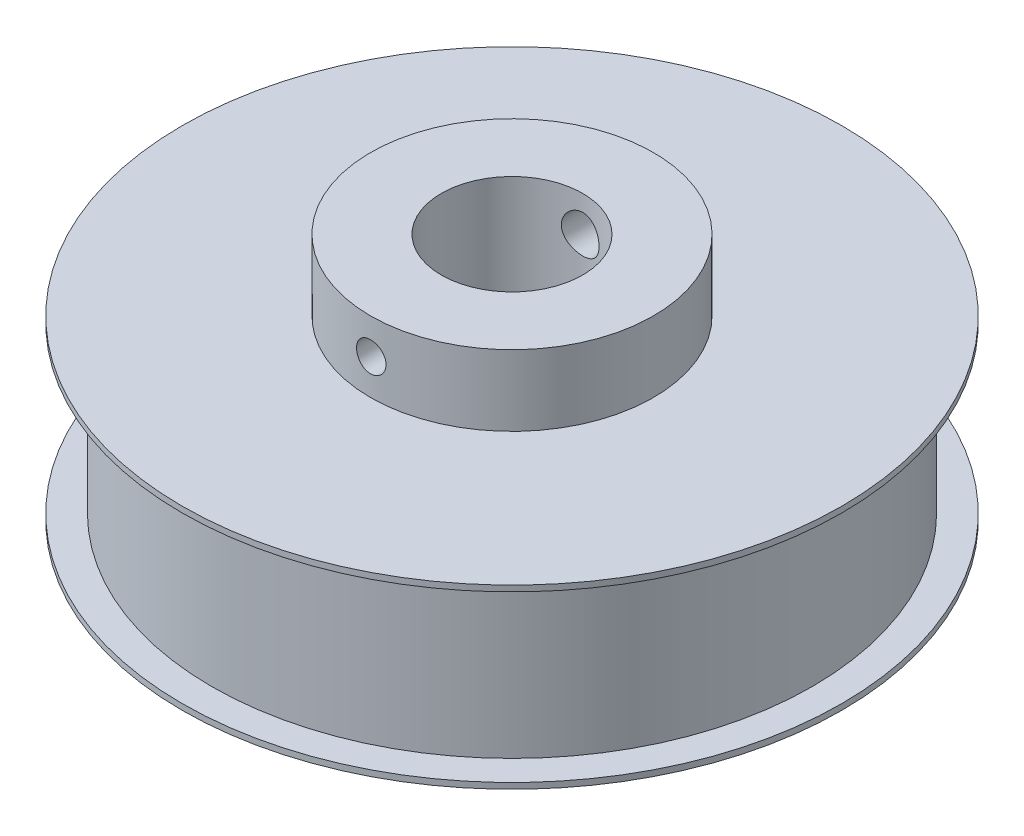
ISO-10303-21;
HEADER;
FILE_DESCRIPTION(('STEP AP214'),'2;1');
FILE_NAME('part.step','',(''),(''),'','','');
FILE_SCHEMA(('AUTOMOTIVE_DESIGN { 1 0 10303 214 1 1 1 1 }'));
ENDSEC;
DATA;
#1=APPLICATION_CONTEXT('core data for automotive mechanical design processes');
#2=APPLICATION_PROTOCOL_DEFINITION('international standard','automotive_design',2000,#1);
#3=PRODUCT_CONTEXT('',#1,'mechanical');
#4=PRODUCT('Part','Part','',(#3));
#5=PRODUCT_RELATED_PRODUCT_CATEGORY('part','',(#4));
#6=PRODUCT_DEFINITION_FORMATION('','',#4);
#7=PRODUCT_DEFINITION_CONTEXT('part definition',#1,'design');
#8=PRODUCT_DEFINITION('design','',#6,#7);
#9=PRODUCT_DEFINITION_SHAPE('','',#8);
#10=(LENGTH_UNIT() NAMED_UNIT(*) SI_UNIT(.MILLI.,.METRE.));
#11=(NAMED_UNIT(*) PLANE_ANGLE_UNIT() SI_UNIT($,.RADIAN.));
#12=(NAMED_UNIT(*) SI_UNIT($,.STERADIAN.) SOLID_ANGLE_UNIT());
#13=UNCERTAINTY_MEASURE_WITH_UNIT(LENGTH_MEASURE(1.E-05),#10,'distance_accuracy_value','');
#14=(GEOMETRIC_REPRESENTATION_CONTEXT(3) GLOBAL_UNCERTAINTY_ASSIGNED_CONTEXT((#13)) GLOBAL_UNIT_ASSIGNED_CONTEXT((#10,
#11,#12)) REPRESENTATION_CONTEXT('',''));
#15=CARTESIAN_POINT('',(0.,0.,0.));
#16=DIRECTION('',(0.,0.,1.));
#17=DIRECTION('',(1.,0.,0.));
#18=AXIS2_PLACEMENT_3D('',#15,#16,#17);
#19=CARTESIAN_POINT('',(0.,13.5,0.));
#20=DIRECTION('',(0.,1.,0.));
#21=DIRECTION('',(0.,0.,1.));
#22=AXIS2_PLACEMENT_3D('',#19,#20,#21);
#23=PLANE('',#22);
#24=CARTESIAN_POINT('',(0.,13.5,0.));
#25=DIRECTION('',(0.,1.,0.));
#26=DIRECTION('',(0.,0.,1.));
#27=AXIS2_PLACEMENT_3D('',#24,#25,#26);
#28=CIRCLE('',#27,6.);
#29=CARTESIAN_POINT('',(0.,13.5,6.));
#30=VERTEX_POINT('',#29);
#31=EDGE_CURVE('E69',#30,#30,#28,.T.);
#32=ORIENTED_EDGE('',*,*,#31,.F.);
#33=EDGE_LOOP('',(#32));
#34=FACE_BOUND('',#33,.T.);
#35=CARTESIAN_POINT('',(0.,13.5,0.));
#36=DIRECTION('',(0.,1.,0.));
#37=DIRECTION('',(0.,0.,1.));
#38=AXIS2_PLACEMENT_3D('',#35,#36,#37);
#39=CIRCLE('',#38,12.);
#40=CARTESIAN_POINT('',(0.,13.5,12.));
#41=VERTEX_POINT('',#40);
#42=EDGE_CURVE('E75',#41,#41,#39,.T.);
#43=ORIENTED_EDGE('',*,*,#42,.T.);
#44=EDGE_LOOP('',(#43));
#45=FACE_BOUND('',#44,.T.);
#46=ADVANCED_FACE('F43',(#34,#45),#23,.T.);
#47=CARTESIAN_POINT('',(0.,7.5,0.));
#48=DIRECTION('',(0.,-1.,0.));
#49=DIRECTION('',(0.,0.,-1.));
#50=AXIS2_PLACEMENT_3D('',#47,#48,#49);
#51=CYLINDRICAL_SURFACE('',#50,25.465);
#52=CARTESIAN_POINT('',(0.,-7.,0.));
#53=DIRECTION('',(0.,1.,0.));
#54=DIRECTION('',(0.,0.,1.));
#55=AXIS2_PLACEMENT_3D('',#52,#53,#54);
#56=CIRCLE('',#55,25.465);
#57=CARTESIAN_POINT('',(0.,-7.,25.465));
#58=VERTEX_POINT('',#57);
#59=EDGE_CURVE('E47',#58,#58,#56,.T.);
#60=ORIENTED_EDGE('',*,*,#59,.T.);
#61=EDGE_LOOP('',(#60));
#62=FACE_BOUND('',#61,.T.);
#63=CARTESIAN_POINT('',(0.,7.,0.));
#64=DIRECTION('',(0.,1.,0.));
#65=DIRECTION('',(0.,0.,1.));
#66=AXIS2_PLACEMENT_3D('',#63,#64,#65);
#67=CIRCLE('',#66,25.465);
#68=CARTESIAN_POINT('',(0.,7.,25.465));
#69=VERTEX_POINT('',#68);
#70=EDGE_CURVE('E10',#69,#69,#67,.T.);
#71=ORIENTED_EDGE('',*,*,#70,.F.);
#72=EDGE_LOOP('',(#71));
#73=FACE_BOUND('',#72,.T.);
#74=ADVANCED_FACE('F45',(#62,#73),#51,.T.);
#75=CARTESIAN_POINT('',(0.,7.,0.));
#76=DIRECTION('',(0.,1.,0.));
#77=DIRECTION('',(0.,0.,1.));
#78=AXIS2_PLACEMENT_3D('',#75,#76,#77);
#79=CYLINDRICAL_SURFACE('',#78,27.965);
#80=CARTESIAN_POINT('',(0.,7.,0.));
#81=DIRECTION('',(0.,1.,0.));
#82=DIRECTION('',(0.,0.,1.));
#83=AXIS2_PLACEMENT_3D('',#80,#81,#82);
#84=CIRCLE('',#83,27.965);
#85=CARTESIAN_POINT('',(0.,7.,27.965));
#86=VERTEX_POINT('',#85);
#87=EDGE_CURVE('E51',#86,#86,#84,.T.);
#88=ORIENTED_EDGE('',*,*,#87,.T.);
#89=EDGE_LOOP('',(#88));
#90=FACE_BOUND('',#89,.T.);
#91=CARTESIAN_POINT('',(0.,7.5,0.));
#92=DIRECTION('',(0.,1.,0.));
#93=DIRECTION('',(0.,0.,1.));
#94=AXIS2_PLACEMENT_3D('',#91,#92,#93);
#95=CIRCLE('',#94,27.965);
#96=CARTESIAN_POINT('',(0.,7.5,27.965));
#97=VERTEX_POINT('',#96);
#98=EDGE_CURVE('E55',#97,#97,#95,.T.);
#99=ORIENTED_EDGE('',*,*,#98,.F.);
#100=EDGE_LOOP('',(#99));
#101=FACE_BOUND('',#100,.T.);
#102=ADVANCED_FACE('F138',(#90,#101),#79,.T.);
#103=CARTESIAN_POINT('',(0.,7.,0.));
#104=DIRECTION('',(0.,1.,0.));
#105=DIRECTION('',(0.,0.,1.));
#106=AXIS2_PLACEMENT_3D('',#103,#104,#105);
#107=PLANE('',#106);
#108=ORIENTED_EDGE('',*,*,#70,.T.);
#109=EDGE_LOOP('',(#108));
#110=FACE_BOUND('',#109,.T.);
#111=ORIENTED_EDGE('',*,*,#87,.F.);
#112=EDGE_LOOP('',(#111));
#113=FACE_BOUND('',#112,.T.);
#114=ADVANCED_FACE('F135',(#110,#113),#107,.F.);
#115=CARTESIAN_POINT('',(0.,7.5,0.));
#116=DIRECTION('',(0.,1.,0.));
#117=DIRECTION('',(0.,0.,1.));
#118=AXIS2_PLACEMENT_3D('',#115,#116,#117);
#119=PLANE('',#118);
#120=ORIENTED_EDGE('',*,*,#98,.T.);
#121=EDGE_LOOP('',(#120));
#122=FACE_BOUND('',#121,.T.);
#123=CARTESIAN_POINT('',(0.,7.5,0.));
#124=DIRECTION('',(0.,1.,0.));
#125=DIRECTION('',(0.,0.,1.));
#126=AXIS2_PLACEMENT_3D('',#123,#124,#125);
#127=CIRCLE('',#126,12.);
#128=CARTESIAN_POINT('',(0.,7.5,12.));
#129=VERTEX_POINT('',#128);
#130=EDGE_CURVE('E72',#129,#129,#127,.F.);
#131=ORIENTED_EDGE('',*,*,#130,.T.);
#132=EDGE_LOOP('',(#131));
#133=FACE_BOUND('',#132,.T.);
#134=ADVANCED_FACE('F133',(#122,#133),#119,.T.);
#135=CARTESIAN_POINT('',(0.,-7.,0.));
#136=DIRECTION('',(0.,-1.,0.));
#137=DIRECTION('',(0.,0.,-1.));
#138=AXIS2_PLACEMENT_3D('',#135,#136,#137);
#139=CYLINDRICAL_SURFACE('',#138,27.965);
#140=CARTESIAN_POINT('',(0.,-7.,0.));
#141=DIRECTION('',(0.,1.,0.));
#142=DIRECTION('',(0.,0.,1.));
#143=AXIS2_PLACEMENT_3D('',#140,#141,#142);
#144=CIRCLE('',#143,27.965);
#145=CARTESIAN_POINT('',(0.,-7.,27.965));
#146=VERTEX_POINT('',#145);
#147=EDGE_CURVE('E63',#146,#146,#144,.T.);
#148=ORIENTED_EDGE('',*,*,#147,.F.);
#149=EDGE_LOOP('',(#148));
#150=FACE_BOUND('',#149,.T.);
#151=CARTESIAN_POINT('',(0.,-7.5,0.));
#152=DIRECTION('',(0.,1.,0.));
#153=DIRECTION('',(0.,0.,1.));
#154=AXIS2_PLACEMENT_3D('',#151,#152,#153);
#155=CIRCLE('',#154,27.965);
#156=CARTESIAN_POINT('',(0.,-7.5,27.965));
#157=VERTEX_POINT('',#156);
#158=EDGE_CURVE('E60',#157,#157,#155,.T.);
#159=ORIENTED_EDGE('',*,*,#158,.T.);
#160=EDGE_LOOP('',(#159));
#161=FACE_BOUND('',#160,.T.);
#162=ADVANCED_FACE('F129',(#150,#161),#139,.T.);
#163=CARTESIAN_POINT('',(0.,-7.,0.));
#164=DIRECTION('',(0.,1.,0.));
#165=DIRECTION('',(0.,0.,1.));
#166=AXIS2_PLACEMENT_3D('',#163,#164,#165);
#167=PLANE('',#166);
#168=ORIENTED_EDGE('',*,*,#59,.F.);
#169=EDGE_LOOP('',(#168));
#170=FACE_BOUND('',#169,.T.);
#171=ORIENTED_EDGE('',*,*,#147,.T.);
#172=EDGE_LOOP('',(#171));
#173=FACE_BOUND('',#172,.T.);
#174=ADVANCED_FACE('F126',(#170,#173),#167,.T.);
#175=CARTESIAN_POINT('',(0.,-7.5,0.));
#176=DIRECTION('',(0.,1.,0.));
#177=DIRECTION('',(0.,0.,1.));
#178=AXIS2_PLACEMENT_3D('',#175,#176,#177);
#179=PLANE('',#178);
#180=CARTESIAN_POINT('',(0.,-7.5,0.));
#181=DIRECTION('',(0.,1.,0.));
#182=DIRECTION('',(0.,0.,1.));
#183=AXIS2_PLACEMENT_3D('',#180,#181,#182);
#184=CIRCLE('',#183,6.);
#185=CARTESIAN_POINT('',(0.,-7.5,6.));
#186=VERTEX_POINT('',#185);
#187=EDGE_CURVE('E64',#186,#186,#184,.T.);
#188=ORIENTED_EDGE('',*,*,#187,.T.);
#189=EDGE_LOOP('',(#188));
#190=FACE_BOUND('',#189,.T.);
#191=ORIENTED_EDGE('',*,*,#158,.F.);
#192=EDGE_LOOP('',(#191));
#193=FACE_BOUND('',#192,.T.);
#194=ADVANCED_FACE('F121',(#190,#193),#179,.F.);
#195=CARTESIAN_POINT('',(0.,-7.5,0.));
#196=DIRECTION('',(0.,1.,0.));
#197=DIRECTION('',(0.,0.,1.));
#198=AXIS2_PLACEMENT_3D('',#195,#196,#197);
#199=CYLINDRICAL_SURFACE('',#198,6.);
#200=CARTESIAN_POINT('',(1.6,10.5,-5.78273291792039));
#201=CARTESIAN_POINT('',(1.59999787452612,10.411859249809,-5.7827344455633));
#202=CARTESIAN_POINT('',(1.59269194579771,10.3236959996195,-5.78477011639344));
#203=CARTESIAN_POINT('',(1.56371666608212,10.1499156627546,-5.79266848924472));
#204=CARTESIAN_POINT('',(1.54204010896768,10.0642998760175,-5.79853311126453));
#205=CARTESIAN_POINT('',(1.48508676448053,9.89815354404267,-5.81337900141366));
#206=CARTESIAN_POINT('',(1.4498291003374,9.81761603293728,-5.82235588547335));
#207=CARTESIAN_POINT('',(1.36677427650964,9.66358660795212,-5.8424092393635));
#208=CARTESIAN_POINT('',(1.3189761427316,9.5900952419944,-5.85348587227547));
#209=CARTESIAN_POINT('',(1.21091878299647,9.45040596240983,-5.87680111642766));
#210=CARTESIAN_POINT('',(1.15040238003366,9.38441038602843,-5.88906032893152));
#211=CARTESIAN_POINT('',(1.01917941827217,9.26337473843904,-5.91318161149208));
#212=CARTESIAN_POINT('',(0.948471804277313,9.20833580308657,-5.92504364026752));
#213=CARTESIAN_POINT('',(0.797470536698613,9.10993204927766,-5.94726390774734));
#214=CARTESIAN_POINT('',(0.717041455903581,9.06676838509372,-5.95759501009834));
#215=CARTESIAN_POINT('',(0.54974643578327,8.9946522917062,-5.97535300969467));
#216=CARTESIAN_POINT('',(0.46288158470008,8.96569746617476,-5.9827803966101));
#217=CARTESIAN_POINT('',(0.28729276944807,8.92347582381139,-5.99374842861169));
#218=CARTESIAN_POINT('',(0.198656979360731,8.90986481869927,-5.99737421400212));
#219=CARTESIAN_POINT('',(0.0202908428068591,8.89763430391426,-6.000628196942));
#220=CARTESIAN_POINT('',(-0.0694393179508251,8.89901228509589,-6.00025706357286));
#221=CARTESIAN_POINT('',(-0.245051389689078,8.91647825003158,-5.99562140687813));
#222=CARTESIAN_POINT('',(-0.330973280576889,8.93219436610904,-5.99145531221602));
#223=CARTESIAN_POINT('',(-0.498913052456844,8.97728971022556,-5.97981398872374));
#224=CARTESIAN_POINT('',(-0.580930710544465,9.00666971734884,-5.97233857120463));
#225=CARTESIAN_POINT('',(-0.739683156118043,9.07854387807391,-5.95477255279923));
#226=CARTESIAN_POINT('',(-0.816357349063632,9.12116544568057,-5.94465670302171));
#227=CARTESIAN_POINT('',(-0.961591999011612,9.21821505560728,-5.9228997480757));
#228=CARTESIAN_POINT('',(-1.03015087046869,9.27264539922254,-5.91125834578275));
#229=CARTESIAN_POINT('',(-1.15942829557249,9.39374148634714,-5.88729018351104));
#230=CARTESIAN_POINT('',(-1.21984153614219,9.46073155603952,-5.87495335495478));
#231=CARTESIAN_POINT('',(-1.32865065683815,9.60401974099103,-5.85130724018329));
#232=CARTESIAN_POINT('',(-1.37704580423844,9.68031842336025,-5.83999801664631));
#233=CARTESIAN_POINT('',(-1.46067743349021,9.84072008145716,-5.81964721826454));
#234=CARTESIAN_POINT('',(-1.49583093280429,9.92486828073094,-5.81062005680583));
#235=CARTESIAN_POINT('',(-1.55139201348531,10.0981811995636,-5.79603460063156));
#236=CARTESIAN_POINT('',(-1.57180325169042,10.1873446691587,-5.79047544571885));
#237=CARTESIAN_POINT('',(-1.59677405674218,10.3653017688173,-5.78363868515234));
#238=CARTESIAN_POINT('',(-1.60178906096974,10.4540268388886,-5.78223810662157));
#239=CARTESIAN_POINT('',(-1.597079848984,10.631047818242,-5.78354062803713));
#240=CARTESIAN_POINT('',(-1.58735720137773,10.7193437721938,-5.78624329125356));
#241=CARTESIAN_POINT('',(-1.55385017495931,10.8912452752781,-5.79532899431386));
#242=CARTESIAN_POINT('',(-1.53033958330325,10.9749083503511,-5.80164031753083));
#243=CARTESIAN_POINT('',(-1.47023189380391,11.1371037050867,-5.81716215168585));
#244=CARTESIAN_POINT('',(-1.43363308701324,11.2156353131416,-5.82637304120572));
#245=CARTESIAN_POINT('',(-1.34746324406962,11.3672439659485,-5.84690857976629));
#246=CARTESIAN_POINT('',(-1.29762476190338,11.4401631807119,-5.8582752389782));
#247=CARTESIAN_POINT('',(-1.18672182390012,11.5767706413624,-5.88174273547405));
#248=CARTESIAN_POINT('',(-1.12565525778373,11.6404571479633,-5.89384371048319));
#249=CARTESIAN_POINT('',(-0.991923026003868,11.7586819786,-5.91783971907433));
#250=CARTESIAN_POINT('',(-0.918973132807074,11.8129027015829,-5.92971869219044));
#251=CARTESIAN_POINT('',(-0.764742748752592,11.9083287899284,-5.95157336013737));
#252=CARTESIAN_POINT('',(-0.683462701615105,11.9495348480631,-5.96154915626333));
#253=CARTESIAN_POINT('',(-0.515451307860694,12.0173837058892,-5.978409207194));
#254=CARTESIAN_POINT('',(-0.428766282305865,12.0441352155548,-5.98531646784308));
#255=CARTESIAN_POINT('',(-0.251919507785054,12.0826309824515,-5.99536243029798));
#256=CARTESIAN_POINT('',(-0.161758533856197,12.0943785654198,-5.99850196723977));
#257=CARTESIAN_POINT('',(0.016513601076927,12.1023246589931,-6.0006193075016));
#258=CARTESIAN_POINT('',(0.104602809222312,12.0989890553049,-5.99972181030494));
#259=CARTESIAN_POINT('',(0.278918643704558,12.0779452051399,-5.9941479278306));
#260=CARTESIAN_POINT('',(0.365145339850185,12.0602374983065,-5.98947168443723));
#261=CARTESIAN_POINT('',(0.532728098771437,12.011215516065,-5.97689048312844));
#262=CARTESIAN_POINT('',(0.614113609481484,11.9799957652217,-5.96900797751776));
#263=CARTESIAN_POINT('',(0.770537678776834,11.9049203186034,-5.95083853212803));
#264=CARTESIAN_POINT('',(0.845575345328786,11.8610628507112,-5.9405512551794));
#265=CARTESIAN_POINT('',(0.989342614939897,11.7605933822889,-5.91833064980799));
#266=CARTESIAN_POINT('',(1.05785068939028,11.7036724954356,-5.90636074702983));
#267=CARTESIAN_POINT('',(1.18450029724544,11.5792778005135,-5.88227200056129));
#268=CARTESIAN_POINT('',(1.24263909793084,11.5118012193649,-5.87015311850574));
#269=CARTESIAN_POINT('',(1.34816560187261,11.3664252833275,-5.84683167732792));
#270=CARTESIAN_POINT('',(1.39528875413901,11.2883293490008,-5.83565513061492));
#271=CARTESIAN_POINT('',(1.47566951228968,11.1250349512375,-5.81585115203583));
#272=CARTESIAN_POINT('',(1.50893618695116,11.0398411771482,-5.80722205399804));
#273=CARTESIAN_POINT('',(1.5563049940103,10.8791349311728,-5.79468800506476));
#274=CARTESIAN_POINT('',(1.57265214719334,10.8043189883583,-5.79024112213281));
#275=CARTESIAN_POINT('',(1.5944999543536,10.6530075536011,-5.78426308173731));
#276=CARTESIAN_POINT('',(1.60000184505801,10.5765122541679,-5.78273159182091));
#277=CARTESIAN_POINT('',(1.6,10.5,-5.78273291792039));
#278=B_SPLINE_CURVE_WITH_KNOTS('',3,(#200,#201,#202,#203,#204,#205,#206,#207,#208,#209,#210,
#211,#212,#213,#214,#215,#216,#217,#218,#219,#220,#221,#222,#223,#224,#225,#226,#227,#228,#229,
#230,#231,#232,#233,#234,#235,#236,#237,#238,#239,#240,#241,#242,#243,#244,#245,#246,#247,#248,
#249,#250,#251,#252,#253,#254,#255,#256,#257,#258,#259,#260,#261,#262,#263,#264,#265,#266,#267,
#268,#269,#270,#271,#272,#273,#274,#275,#276,#277),.UNSPECIFIED.,.T.,.F.,(4,2,2,2,2,2,2,2,2,2,2,
2,2,2,2,2,2,2,2,2,2,2,2,2,2,2,2,2,2,2,2,2,2,2,2,2,2,2,4),(0.,0.264140902492819,
0.528414358280161,0.792317049276935,1.05624024524884,1.32612732904169,1.59604237699569,
1.87028165896642,2.14447467443397,2.41238643453184,2.68025334708482,2.94136456640642,
3.20249067552556,3.46621159124456,3.72998394715593,4.00185409840264,4.27374082111663,
4.54730412077229,4.82079953934806,5.08612267391536,5.35141757070658,5.61161480341915,
5.87184602287714,6.13779707970073,6.40379817229034,6.67748725563561,6.95116176802337,
7.22274831668975,7.49427465563059,7.75747243929025,8.02066034086224,8.28203611890787,
8.54344856608625,8.81183083189116,9.08028372300692,9.35464031183426,9.62881705674849,
9.85813574131028,10.0874282742632),.UNSPECIFIED.);
#279=CARTESIAN_POINT('',(1.6,10.5,-5.78273291792039));
#280=VERTEX_POINT('',#279);
#281=EDGE_CURVE('E112',#280,#280,#278,.T.);
#282=ORIENTED_EDGE('',*,*,#281,.T.);
#283=EDGE_LOOP('',(#282));
#284=FACE_BOUND('',#283,.T.);
#285=CARTESIAN_POINT('',(0.,9.25000000000001,6.));
#286=CARTESIAN_POINT('',(0.0694090417016603,9.25000247746923,5.99999871526651));
#287=CARTESIAN_POINT('',(0.138848789520875,9.25580066571876,5.99878328775043));
#288=CARTESIAN_POINT('',(0.275761316266992,9.27881934953286,5.9940520099068));
#289=CARTESIAN_POINT('',(0.343232560128311,9.29604852303694,5.99053441189248));
#290=CARTESIAN_POINT('',(0.474209132291339,9.34137045492183,5.98159109196202));
#291=CARTESIAN_POINT('',(0.537718336709181,9.36945239599889,5.97616727052645));
#292=CARTESIAN_POINT('',(0.659120328605954,9.43564960885619,5.96399927809859));
#293=CARTESIAN_POINT('',(0.717013367534322,9.47376443115584,5.95725516625975));
#294=CARTESIAN_POINT('',(0.826390324308831,9.55953634019065,5.94307700024651));
#295=CARTESIAN_POINT('',(0.877780244162679,9.60731200123509,5.93563505848532));
#296=CARTESIAN_POINT('',(0.971877776769386,9.71079465919511,5.92095657692448));
#297=CARTESIAN_POINT('',(1.01458467096098,9.76650231187227,5.91372005416683));
#298=CARTESIAN_POINT('',(1.09051031677216,9.88495196876616,5.90019442595308));
#299=CARTESIAN_POINT('',(1.1236305468065,9.94775838450275,5.89391545174828));
#300=CARTESIAN_POINT('',(1.17881119348063,10.0781974517728,5.8831284065002));
#301=CARTESIAN_POINT('',(1.20087280167641,10.1458295824425,5.87862014467568));
#302=CARTESIAN_POINT('',(1.23300240133736,10.2829852374156,5.87196500986123));
#303=CARTESIAN_POINT('',(1.24323597696798,10.3524683593348,5.86978556855866));
#304=CARTESIAN_POINT('',(1.25193357655614,10.4921968428626,5.86793690716491));
#305=CARTESIAN_POINT('',(1.25039890894686,10.5624421188653,5.86826740800981));
#306=CARTESIAN_POINT('',(1.23573719037196,10.7004810279752,5.87137174319175));
#307=CARTESIAN_POINT('',(1.2228010523272,10.7682959796612,5.87410533679901));
#308=CARTESIAN_POINT('',(1.18600543529945,10.9007715096449,5.88164437615942));
#309=CARTESIAN_POINT('',(1.16214539481381,10.9654319256063,5.88644992841317));
#310=CARTESIAN_POINT('',(1.10400003213928,11.090307228416,5.89763191464102));
#311=CARTESIAN_POINT('',(1.06964002534236,11.1504862965271,5.90401953785586));
#312=CARTESIAN_POINT('',(0.991522699274812,11.2642957442682,5.91763890010721));
#313=CARTESIAN_POINT('',(0.947764212262582,11.317925308836,5.92487074398537));
#314=CARTESIAN_POINT('',(0.851074921546778,11.4182139610804,5.93953730929909));
#315=CARTESIAN_POINT('',(0.797981433412079,11.464716168897,5.94697323199473));
#316=CARTESIAN_POINT('',(0.684667288611795,11.548180442229,5.96108088143001));
#317=CARTESIAN_POINT('',(0.624446525025762,11.5851423645984,5.96775259670236));
#318=CARTESIAN_POINT('',(0.498405541235475,11.6485100815359,5.97959870942815));
#319=CARTESIAN_POINT('',(0.432575461926497,11.6748968045671,5.98477039710258));
#320=CARTESIAN_POINT('',(0.297284620972153,11.7161917048355,5.99301338211281));
#321=CARTESIAN_POINT('',(0.227824338595088,11.7311013932314,5.99608495596053));
#322=CARTESIAN_POINT('',(0.0885918657008346,11.7487942520679,5.99974275215456));
#323=CARTESIAN_POINT('',(0.0188480555261786,11.7517919414942,6.00037293537579));
#324=CARTESIAN_POINT('',(-0.120143798757714,11.7461550500309,5.99919952252774));
#325=CARTESIAN_POINT('',(-0.189391872962257,11.7375211813984,5.99739607548153));
#326=CARTESIAN_POINT('',(-0.324726367119812,11.7090443465305,5.99158564979184));
#327=CARTESIAN_POINT('',(-0.390837192894204,11.6893125146165,5.98760052868077));
#328=CARTESIAN_POINT('',(-0.518811446661329,11.6393221395786,5.97787227242395));
#329=CARTESIAN_POINT('',(-0.580674536336772,11.609062759134,5.97212899744579));
#330=CARTESIAN_POINT('',(-0.69929430694349,11.5384196217624,5.95941241490714));
#331=CARTESIAN_POINT('',(-0.755973219469829,11.4979080704309,5.9524239381233));
#332=CARTESIAN_POINT('',(-0.861805445886515,11.4080804369237,5.93802568299709));
#333=CARTESIAN_POINT('',(-0.910957877913281,11.3587633244811,5.93061585542511));
#334=CARTESIAN_POINT('',(-1.0011786486518,11.2517444230003,5.91606024531377));
#335=CARTESIAN_POINT('',(-1.04209914600204,11.1939169680447,5.90892089307501));
#336=CARTESIAN_POINT('',(-1.11364719079243,11.0720837157862,5.89585601015806));
#337=CARTESIAN_POINT('',(-1.14427516677863,11.0080781758609,5.88993042894651));
#338=CARTESIAN_POINT('',(-1.19417246443921,10.8760388037018,5.88001700708041));
#339=CARTESIAN_POINT('',(-1.21350309828031,10.8080289628342,5.87601872784687));
#340=CARTESIAN_POINT('',(-1.24044038523407,10.6696334495077,5.87039184709697));
#341=CARTESIAN_POINT('',(-1.2480487154444,10.5992481183806,5.86876290660367));
#342=CARTESIAN_POINT('',(-1.25125926487611,10.4595865990004,5.86807907308506));
#343=CARTESIAN_POINT('',(-1.24709542622725,10.3903159297779,5.86897402321502));
#344=CARTESIAN_POINT('',(-1.22739905314031,10.2534859910798,5.87312447254928));
#345=CARTESIAN_POINT('',(-1.21186662782265,10.1859267051839,5.87637994909626));
#346=CARTESIAN_POINT('',(-1.16998217768584,10.0546022281093,5.88486132447716));
#347=CARTESIAN_POINT('',(-1.14366117568421,9.99082675351308,5.8900815700793));
#348=CARTESIAN_POINT('',(-1.08097457299757,9.86856122397334,5.90190705738738));
#349=CARTESIAN_POINT('',(-1.04460803983029,9.81007166036688,5.9085124276546));
#350=CARTESIAN_POINT('',(-0.962073695342405,9.69887837292056,5.92251579551146));
#351=CARTESIAN_POINT('',(-0.915737890418221,9.64630087543502,5.92992613868404));
#352=CARTESIAN_POINT('',(-0.81492443811533,9.54959050677365,5.94461839583213));
#353=CARTESIAN_POINT('',(-0.760444918832964,9.50545958244852,5.9519002798488));
#354=CARTESIAN_POINT('',(-0.644134427507699,9.42641142681595,5.96561444547637));
#355=CARTESIAN_POINT('',(-0.582225921521345,9.39160632011372,5.97203596073244));
#356=CARTESIAN_POINT('',(-0.453319843998451,9.33294977156998,5.98319908494092));
#357=CARTESIAN_POINT('',(-0.386326781907241,9.30908875281813,5.98794216182101));
#358=CARTESIAN_POINT('',(-0.266015292900103,9.27745972171158,5.99432499781444));
#359=CARTESIAN_POINT('',(-0.213367593727928,9.26718123679115,5.99644035661395));
#360=CARTESIAN_POINT('',(-0.107152674176536,9.25345054572268,5.99927832789758));
#361=CARTESIAN_POINT('',(-0.0535854878488715,9.24999808733282,6.00000099184586));
#362=CARTESIAN_POINT('',(0.,9.25000000000001,6.));
#363=B_SPLINE_CURVE_WITH_KNOTS('',3,(#285,#286,#287,#288,#289,#290,#291,#292,#293,#294,#295,
#296,#297,#298,#299,#300,#301,#302,#303,#304,#305,#306,#307,#308,#309,#310,#311,#312,#313,#314,
#315,#316,#317,#318,#319,#320,#321,#322,#323,#324,#325,#326,#327,#328,#329,#330,#331,#332,#333,
#334,#335,#336,#337,#338,#339,#340,#341,#342,#343,#344,#345,#346,#347,#348,#349,#350,#351,#352,
#353,#354,#355,#356,#357,#358,#359,#360,#361,#362),.UNSPECIFIED.,.T.,.F.,(4,2,2,2,2,2,2,2,2,2,2,
2,2,2,2,2,2,2,2,2,2,2,2,2,2,2,2,2,2,2,2,2,2,2,2,2,2,2,4),(0.,0.208031045103182,
0.416220199906222,0.624202378825438,0.832175241572985,1.04287526388122,1.25359271551785,
1.46640449178548,1.67919333285489,1.88896575169853,2.09871484767163,2.30501712129058,
2.51133000030278,2.71914592416748,2.92698768368033,3.13889526355464,3.35080602278216,
3.5630972449966,3.77536051045769,3.98378339407673,4.19219351552275,4.39855286632619,
4.60492863390931,4.81401583995734,5.02312752564571,5.23571263829333,5.44828889851306,
5.65970050095022,5.87108185414181,6.07829223291035,6.28550062281357,6.49211731393252,
6.69875319081476,6.90919024830305,7.11967575117365,7.33258864398252,7.54531486464969,
7.70592588477276,7.86653096973387),.UNSPECIFIED.);
#364=CARTESIAN_POINT('',(0.,9.25000000000001,6.));
#365=VERTEX_POINT('',#364);
#366=EDGE_CURVE('E86',#365,#365,#363,.T.);
#367=ORIENTED_EDGE('',*,*,#366,.T.);
#368=EDGE_LOOP('',(#367));
#369=FACE_BOUND('',#368,.T.);
#370=ORIENTED_EDGE('',*,*,#187,.F.);
#371=EDGE_LOOP('',(#370));
#372=FACE_BOUND('',#371,.T.);
#373=ORIENTED_EDGE('',*,*,#31,.T.);
#374=EDGE_LOOP('',(#373));
#375=FACE_BOUND('',#374,.T.);
#376=ADVANCED_FACE('F117',(#284,#369,#372,#375),#199,.F.);
#377=CARTESIAN_POINT('',(0.,-46.2401153701776,0.));
#378=DIRECTION('',(0.,1.,0.));
#379=DIRECTION('',(0.,0.,1.));
#380=AXIS2_PLACEMENT_3D('',#377,#378,#379);
#381=CYLINDRICAL_SURFACE('',#380,12.);
#382=CARTESIAN_POINT('',(1.6,10.5,-11.8928549978548));
#383=CARTESIAN_POINT('',(1.59999622875874,10.4105569156318,-11.8928563562661));
#384=CARTESIAN_POINT('',(1.59247461363655,10.3210591735257,-11.8938749179493));
#385=CARTESIAN_POINT('',(1.56259037013244,10.1445580301489,-11.8978371896282));
#386=CARTESIAN_POINT('',(1.54021255719325,10.0575572760697,-11.9007828692913));
#387=CARTESIAN_POINT('',(1.48129048912082,9.88863090541276,-11.9082599369349));
#388=CARTESIAN_POINT('',(1.44475624220001,9.80670175070419,-11.9127902044355));
#389=CARTESIAN_POINT('',(1.35858051904583,9.65015113943401,-11.9229246580757));
#390=CARTESIAN_POINT('',(1.30894114610784,9.57552851285002,-11.9285286718458));
#391=CARTESIAN_POINT('',(1.19762696391605,9.43522123626478,-11.9402190185494));
#392=CARTESIAN_POINT('',(1.13588545819885,9.36958970745637,-11.9463079079454));
#393=CARTESIAN_POINT('',(1.0022633829809,9.24958700363501,-11.9582590100703));
#394=CARTESIAN_POINT('',(0.93038229317759,9.19521640681908,-11.9641212111471));
#395=CARTESIAN_POINT('',(0.77818537994208,9.09908652662685,-11.9749847980817));
#396=CARTESIAN_POINT('',(0.697838750168973,9.0573756085678,-11.9799828520179));
#397=CARTESIAN_POINT('',(0.531203052829892,8.98805906865537,-11.9885268273268));
#398=CARTESIAN_POINT('',(0.444914235137918,8.96045285409786,-11.9920728097169));
#399=CARTESIAN_POINT('',(0.269388300011268,8.92028887233579,-11.9972950895648));
#400=CARTESIAN_POINT('',(0.180171778775915,8.90764254799044,-11.9989823856406));
#401=CARTESIAN_POINT('',(0.000868001842923186,8.89748271301055,-12.0003347837722));
#402=CARTESIAN_POINT('',(-0.0892192149779749,8.89996852981079,-11.9999999757026));
#403=CARTESIAN_POINT('',(-0.267104099572617,8.91993178443276,-11.9973547529353));
#404=CARTESIAN_POINT('',(-0.35491266988943,8.93731397179652,-11.9950568907025));
#405=CARTESIAN_POINT('',(-0.526355298170045,8.98642746161721,-11.9887577927383));
#406=CARTESIAN_POINT('',(-0.609989267633473,9.01815906813449,-11.9847565209123));
#407=CARTESIAN_POINT('',(-0.771001446739304,9.09517075289746,-11.9754785520333));
#408=CARTESIAN_POINT('',(-0.848359879482609,9.14049169854647,-11.970198017167));
#409=CARTESIAN_POINT('',(-0.994409352587829,9.24336580582629,-11.9589516033523));
#410=CARTESIAN_POINT('',(-1.06309994069345,9.30091960530225,-11.9529856886743));
#411=CARTESIAN_POINT('',(-1.19042404923631,9.42715827868715,-11.9409807047653));
#412=CARTESIAN_POINT('',(-1.24897522682417,9.49592621455491,-11.9349414273952));
#413=CARTESIAN_POINT('',(-1.35371754445753,9.64235674509806,-11.9235159901539));
#414=CARTESIAN_POINT('',(-1.39990863549082,9.72001937504238,-11.9181298328726));
#415=CARTESIAN_POINT('',(-1.478626288692,9.88211200027736,-11.9086206106747));
#416=CARTESIAN_POINT('',(-1.51114567125365,9.96654552361479,-11.9044982097183));
#417=CARTESIAN_POINT('',(-1.56152072035939,10.1397424165107,-11.8979958037258));
#418=CARTESIAN_POINT('',(-1.57937719483315,10.2285055472213,-11.8956157026893));
#419=CARTESIAN_POINT('',(-1.59980928614981,10.407113068004,-11.8928851600828));
#420=CARTESIAN_POINT('',(-1.60250104879049,10.496943944266,-11.892519292093));
#421=CARTESIAN_POINT('',(-1.59283430551036,10.6757754048838,-11.8938177943736));
#422=CARTESIAN_POINT('',(-1.58047616583821,10.7647760093916,-11.895482115238));
#423=CARTESIAN_POINT('',(-1.54115844029615,10.9390687891245,-11.9006393634942));
#424=CARTESIAN_POINT('',(-1.51425560258688,11.0243739944145,-11.9041251823012));
#425=CARTESIAN_POINT('',(-1.446670760641,11.1892631307619,-11.9125268721153));
#426=CARTESIAN_POINT('',(-1.40598820967506,11.268846834659,-11.9174427998627));
#427=CARTESIAN_POINT('',(-1.31171525133768,11.4205578483527,-11.9281875729561));
#428=CARTESIAN_POINT('',(-1.2580489853304,11.4926376386946,-11.9340217103131));
#429=CARTESIAN_POINT('',(-1.13943865850239,11.6268087507497,-11.9459291481321));
#430=CARTESIAN_POINT('',(-1.07449409715003,11.6888996289184,-11.9520024591995));
#431=CARTESIAN_POINT('',(-0.934662038686588,11.8017412431369,-11.9637515892427));
#432=CARTESIAN_POINT('',(-0.859712512746017,11.8524154530973,-11.9694245603977));
#433=CARTESIAN_POINT('',(-0.702297961854094,11.9404546257403,-11.9796907318264));
#434=CARTESIAN_POINT('',(-0.619833106010957,11.9778198878049,-11.9842839563879));
#435=CARTESIAN_POINT('',(-0.449978218018744,12.0380554092705,-11.9918605175292));
#436=CARTESIAN_POINT('',(-0.362603827397887,12.0609691432668,-11.9948486785663));
#437=CARTESIAN_POINT('',(-0.185205194738557,12.0917923883688,-11.9988985334929));
#438=CARTESIAN_POINT('',(-0.0951810897598569,12.0997026741662,-11.999960326849));
#439=CARTESIAN_POINT('',(0.0842158989692724,12.1002786137923,-12.0000371779874));
#440=CARTESIAN_POINT('',(0.173588420737506,12.0930619764755,-11.9990680393074));
#441=CARTESIAN_POINT('',(0.349837954441884,12.0638391670144,-11.9952234657589));
#442=CARTESIAN_POINT('',(0.436714969872839,12.041833015583,-11.9923480335601));
#443=CARTESIAN_POINT('',(0.605486587671089,11.9836943623387,-11.9850124531398));
#444=CARTESIAN_POINT('',(0.68738344123513,11.9475682988736,-11.9805530272665));
#445=CARTESIAN_POINT('',(0.8439712629047,11.8622275602834,-11.9705419951679));
#446=CARTESIAN_POINT('',(0.918662097919332,11.813012643478,-11.9649903687759));
#447=CARTESIAN_POINT('',(1.05931782885339,11.7024586543971,-11.9533623296788));
#448=CARTESIAN_POINT('',(1.1252137257312,11.6410321678886,-11.9472823223993));
#449=CARTESIAN_POINT('',(1.24580716469773,11.5079815447621,-11.9353109191741));
#450=CARTESIAN_POINT('',(1.30050206024185,11.436355004863,-11.9294195680805));
#451=CARTESIAN_POINT('',(1.39735032782796,11.2845728467433,-11.9184648790805));
#452=CARTESIAN_POINT('',(1.43944752343302,11.204381126792,-11.9134052940863));
#453=CARTESIAN_POINT('',(1.50951614625191,11.0380412259863,-11.9047309326699));
#454=CARTESIAN_POINT('',(1.53750271733087,10.9518995441923,-11.9011146081783));
#455=CARTESIAN_POINT('',(1.5719638430287,10.8044413770197,-11.8966010705995));
#456=CARTESIAN_POINT('',(1.58246198508654,10.744049381626,-11.8952034289778));
#457=CARTESIAN_POINT('',(1.59648132274533,10.6224467924231,-11.8933299317957));
#458=CARTESIAN_POINT('',(1.6000025819381,10.5612362060802,-11.8928540678337));
#459=CARTESIAN_POINT('',(1.6,10.5,-11.8928549978548));
#460=B_SPLINE_CURVE_WITH_KNOTS('',3,(#382,#383,#384,#385,#386,#387,#388,#389,#390,#391,#392,
#393,#394,#395,#396,#397,#398,#399,#400,#401,#402,#403,#404,#405,#406,#407,#408,#409,#410,#411,
#412,#413,#414,#415,#416,#417,#418,#419,#420,#421,#422,#423,#424,#425,#426,#427,#428,#429,#430,
#431,#432,#433,#434,#435,#436,#437,#438,#439,#440,#441,#442,#443,#444,#445,#446,#447,#448,#449,
#450,#451,#452,#453,#454,#455,#456,#457,#458,#459),.UNSPECIFIED.,.T.,.F.,(4,2,2,2,2,2,2,2,2,2,2,
2,2,2,2,2,2,2,2,2,2,2,2,2,2,2,2,2,2,2,2,2,2,2,2,2,2,2,4),(0.,0.268105511391281,
0.536485476866914,0.804676050196965,1.07282360666202,1.34249276095169,1.61217575808027,
1.88287645218354,2.15356577003779,2.42264455618212,2.69171138290122,2.95907046934199,
3.2264352213158,3.49461222763238,3.76280322065939,4.03307932053404,4.30335649213509,
4.57377542122829,4.84417944917518,5.1125096206378,5.3808332622507,5.64811747853112,
5.91541230092804,6.18430822512102,6.45321608598733,6.72387609409839,6.99453001338358,
7.26436579014504,7.53418763375954,7.80191767883276,8.06964734894749,8.33725508278392,
8.60486775823099,8.87446993893391,9.14413574725757,9.41498673583916,9.68554641848827,
9.8691035275364,10.0526589635184),.UNSPECIFIED.);
#461=CARTESIAN_POINT('',(1.6,10.5,-11.8928549978548));
#462=VERTEX_POINT('',#461);
#463=EDGE_CURVE('E107',#462,#462,#460,.T.);
#464=ORIENTED_EDGE('',*,*,#463,.F.);
#465=EDGE_LOOP('',(#464));
#466=FACE_BOUND('',#465,.T.);
#467=CARTESIAN_POINT('',(0.,9.25000000000001,12.));
#468=CARTESIAN_POINT('',(0.0700095494879669,9.25000302378021,11.9999991642872));
#469=CARTESIAN_POINT('',(0.140065002410053,9.25590141119276,11.9993808287118));
#470=CARTESIAN_POINT('',(0.278232608485378,9.27934157732294,11.9969736264618));
#471=CARTESIAN_POINT('',(0.346342552614997,9.29689608246203,11.9951834804073));
#472=CARTESIAN_POINT('',(0.478598413117922,9.34313095006594,11.9906346712346));
#473=CARTESIAN_POINT('',(0.542746737320351,9.37180447580485,11.9878766033589));
#474=CARTESIAN_POINT('',(0.665306503912526,9.43944990943166,11.9817001005453));
#475=CARTESIAN_POINT('',(0.723719060185852,9.47841981232085,11.9782817942095));
#476=CARTESIAN_POINT('',(0.83339001364479,9.5657142953614,11.9711526751922));
#477=CARTESIAN_POINT('',(0.884622960494003,9.61407077334438,11.9674408914449));
#478=CARTESIAN_POINT('',(0.978261562000656,9.71869761231013,11.9601511575164));
#479=CARTESIAN_POINT('',(1.02066680237566,9.77496834449965,11.9565732136228));
#480=CARTESIAN_POINT('',(1.09553719669395,9.89398670534912,11.9499464131795));
#481=CARTESIAN_POINT('',(1.12797918293742,9.95674898299686,11.9468987968275));
#482=CARTESIAN_POINT('',(1.18185422718569,10.0868674028103,11.9416898936638));
#483=CARTESIAN_POINT('',(1.20328757896304,10.1542234223348,11.9395285832006));
#484=CARTESIAN_POINT('',(1.23446116549205,10.2913569487067,11.9363458728961));
#485=CARTESIAN_POINT('',(1.24424374803226,10.3611247315265,11.9353203457101));
#486=CARTESIAN_POINT('',(1.25196903004635,10.5013188561489,11.9345125354877));
#487=CARTESIAN_POINT('',(1.24991206557193,10.571745179203,11.9347302171641));
#488=CARTESIAN_POINT('',(1.23405152506974,10.7109648395856,11.9363804586047));
#489=CARTESIAN_POINT('',(1.22029424848266,10.7797635163118,11.9378082298324));
#490=CARTESIAN_POINT('',(1.18149567318239,10.9140701613044,11.9417102992231));
#491=CARTESIAN_POINT('',(1.15645421038749,10.9795780817052,11.9441846126035));
#492=CARTESIAN_POINT('',(1.09574719612483,11.1055895750614,11.9499064730576));
#493=CARTESIAN_POINT('',(1.06006116722707,11.1660832125459,11.953155508059));
#494=CARTESIAN_POINT('',(0.979092720135934,11.2802402034553,11.9600594875767));
#495=CARTESIAN_POINT('',(0.933809997063834,11.3339033397944,11.9637144449871));
#496=CARTESIAN_POINT('',(0.8346752809381,11.4331450273226,11.9710397802306));
#497=CARTESIAN_POINT('',(0.780783314157837,11.4786836581419,11.97471014815));
#498=CARTESIAN_POINT('',(0.666098532189391,11.5600740328825,11.9816362536886));
#499=CARTESIAN_POINT('',(0.605305708229907,11.5959257644912,11.9848919907809));
#500=CARTESIAN_POINT('',(0.478516764921764,11.6569232865542,11.9906232037876));
#501=CARTESIAN_POINT('',(0.412519629297685,11.6820669798228,11.9930985268321));
#502=CARTESIAN_POINT('',(0.277208837646704,11.7209050636913,11.9969884809875));
#503=CARTESIAN_POINT('',(0.207895289340299,11.7345998258976,11.9984031465247));
#504=CARTESIAN_POINT('',(0.0682648586938704,11.7501004938849,12.0000079610362));
#505=CARTESIAN_POINT('',(-0.00204584741646062,11.7519614723098,12.0002037822377));
#506=CARTESIAN_POINT('',(-0.141978142720367,11.7438864978735,11.9993640699192));
#507=CARTESIAN_POINT('',(-0.21159974201527,11.733950718195,11.9983285544758));
#508=CARTESIAN_POINT('',(-0.348018029476925,11.7026099671781,11.995146140952));
#509=CARTESIAN_POINT('',(-0.414820721686735,11.6812308538946,11.9930017489258));
#510=CARTESIAN_POINT('',(-0.543891723826277,11.6276369307205,11.98784207376));
#511=CARTESIAN_POINT('',(-0.606159923902422,11.5954218584218,11.9848267695301));
#512=CARTESIAN_POINT('',(-0.724642919002305,11.5209344106801,11.9782482392504));
#513=CARTESIAN_POINT('',(-0.780834909391513,11.4786259362103,11.9746830631459));
#514=CARTESIAN_POINT('',(-0.885339382882745,11.385204321023,11.9674108977167));
#515=CARTESIAN_POINT('',(-0.9336516509911,11.3340909401469,11.9637039045259));
#516=CARTESIAN_POINT('',(-1.02121712756248,11.2242697793095,11.9565487724948));
#517=CARTESIAN_POINT('',(-1.06043413579884,11.1655330556455,11.9531017036895));
#518=CARTESIAN_POINT('',(-1.12844682402802,11.0422749355989,11.9468731948153));
#519=CARTESIAN_POINT('',(-1.15724265694647,10.9777536241196,11.9440917449791));
#520=CARTESIAN_POINT('',(-1.20353528386919,10.844880883156,11.9395161797365));
#521=CARTESIAN_POINT('',(-1.22105344529624,10.776536964984,11.9377201981564));
#522=CARTESIAN_POINT('',(-1.24436270906373,10.6378579985983,11.9353131909021));
#523=CARTESIAN_POINT('',(-1.25015417898762,10.5675230128665,11.9347021280856));
#524=CARTESIAN_POINT('',(-1.24984031256418,10.4272183097891,11.9347349734758));
#525=CARTESIAN_POINT('',(-1.24379184136803,10.3572484569021,11.9353728830911));
#526=CARTESIAN_POINT('',(-1.22008919679212,10.2193247728113,11.9378189905869));
#527=CARTESIAN_POINT('',(-1.20243501187646,10.1513709436114,11.9396271896308));
#528=CARTESIAN_POINT('',(-1.15603809633997,10.0194097863068,11.9442084445198));
#529=CARTESIAN_POINT('',(-1.12729720150595,9.95540180686475,11.9469813406187));
#530=CARTESIAN_POINT('',(-1.05954851165035,9.83310909832282,11.9531798687626));
#531=CARTESIAN_POINT('',(-1.02054074557837,9.77482435308571,11.9566054989672));
#532=CARTESIAN_POINT('',(-0.933152337738081,9.66534121935873,11.9637432302473));
#533=CARTESIAN_POINT('',(-0.884729299095293,9.61417675195397,11.9674565796301));
#534=CARTESIAN_POINT('',(-0.779969862539379,9.52067534473859,11.9747399925001));
#535=CARTESIAN_POINT('',(-0.723631576825854,9.47834051681459,11.9783100215432));
#536=CARTESIAN_POINT('',(-0.604472478145267,9.40360857134286,11.9849147120146));
#537=CARTESIAN_POINT('',(-0.541634534666207,9.37123865741696,11.9879478984777));
#538=CARTESIAN_POINT('',(-0.411422843814931,9.31755350869124,11.9931213369361));
#539=CARTESIAN_POINT('',(-0.344054279006823,9.29622587774577,11.9952625896922));
#540=CARTESIAN_POINT('',(-0.230257563143004,9.27051681754004,11.9978761527569));
#541=CARTESIAN_POINT('',(-0.184555489720072,9.26283360450817,11.998668856663));
#542=CARTESIAN_POINT('',(-0.0925756340610826,9.25257420758011,11.999731055421));
#543=CARTESIAN_POINT('',(-0.0462978544563022,9.24999800035087,12.0000005526633));
#544=CARTESIAN_POINT('',(0.,9.25000000000001,12.));
#545=B_SPLINE_CURVE_WITH_KNOTS('',3,(#467,#468,#469,#470,#471,#472,#473,#474,#475,#476,#477,
#478,#479,#480,#481,#482,#483,#484,#485,#486,#487,#488,#489,#490,#491,#492,#493,#494,#495,#496,
#497,#498,#499,#500,#501,#502,#503,#504,#505,#506,#507,#508,#509,#510,#511,#512,#513,#514,#515,
#516,#517,#518,#519,#520,#521,#522,#523,#524,#525,#526,#527,#528,#529,#530,#531,#532,#533,#534,
#535,#536,#537,#538,#539,#540,#541,#542,#543,#544),.UNSPECIFIED.,.T.,.F.,(4,2,2,2,2,2,2,2,2,2,2,
2,2,2,2,2,2,2,2,2,2,2,2,2,2,2,2,2,2,2,2,2,2,2,2,2,2,2,4),(0.,0.209859578808884,
0.419948664798435,0.629908778110757,0.839828036286574,1.05047354994535,1.26112894692692,
1.47227053850522,1.68340649534034,1.89377265772063,2.10413284913259,2.31366447426869,
2.52319914627207,2.73313953815065,2.94308660065495,3.1540384294749,3.36499052642713,
3.57598391968829,3.78697046431323,3.99697438635689,4.20697522546863,4.41650352486905,
4.62603689865992,4.83633120945245,5.04663125704426,5.25775448481456,5.46887461432942,
5.67959355518833,5.89030589077464,6.10000869487955,6.30971170742624,6.51938001130891,
6.72904772399431,6.93968239830689,7.15036739491241,7.36162255036672,7.5726400322329,
7.7114224226112,7.85020417891467),.UNSPECIFIED.);
#546=CARTESIAN_POINT('',(0.,9.25000000000001,12.));
#547=VERTEX_POINT('',#546);
#548=EDGE_CURVE('E78',#547,#547,#545,.T.);
#549=ORIENTED_EDGE('',*,*,#548,.F.);
#550=EDGE_LOOP('',(#549));
#551=FACE_BOUND('',#550,.T.);
#552=ORIENTED_EDGE('',*,*,#130,.F.);
#553=EDGE_LOOP('',(#552));
#554=FACE_BOUND('',#553,.T.);
#555=ORIENTED_EDGE('',*,*,#42,.F.);
#556=EDGE_LOOP('',(#555));
#557=FACE_BOUND('',#556,.T.);
#558=ADVANCED_FACE('F92',(#466,#551,#554,#557),#381,.T.);
#559=CARTESIAN_POINT('',(0.,10.5,12.));
#560=DIRECTION('',(0.,0.,1.));
#561=DIRECTION('',(1.,0.,0.));
#562=AXIS2_PLACEMENT_3D('',#559,#560,#561);
#563=CYLINDRICAL_SURFACE('',#562,1.24999999999999);
#564=ORIENTED_EDGE('',*,*,#548,.T.);
#565=EDGE_LOOP('',(#564));
#566=FACE_BOUND('',#565,.T.);
#567=ORIENTED_EDGE('',*,*,#366,.F.);
#568=EDGE_LOOP('',(#567));
#569=FACE_BOUND('',#568,.T.);
#570=ADVANCED_FACE('F95',(#566,#569),#563,.F.);
#571=CARTESIAN_POINT('',(0.,10.5,0.));
#572=DIRECTION('',(0.,0.,1.));
#573=DIRECTION('',(1.,0.,0.));
#574=AXIS2_PLACEMENT_3D('',#571,#572,#573);
#575=CYLINDRICAL_SURFACE('',#574,1.6);
#576=ORIENTED_EDGE('',*,*,#463,.T.);
#577=EDGE_LOOP('',(#576));
#578=FACE_BOUND('',#577,.T.);
#579=ORIENTED_EDGE('',*,*,#281,.F.);
#580=EDGE_LOOP('',(#579));
#581=FACE_BOUND('',#580,.T.);
#582=ADVANCED_FACE('F99',(#578,#581),#575,.F.);
#583=CLOSED_SHELL('',(#46,#74,#102,#114,#134,#162,#174,#194,#376,#558,#570,#582));
#584=MANIFOLD_SOLID_BREP('B2',#583);
#585=ADVANCED_BREP_SHAPE_REPRESENTATION('',(#18,#584),#14);
#586=SHAPE_DEFINITION_REPRESENTATION(#9,#585);
ENDSEC;
END-ISO-10303-21;
